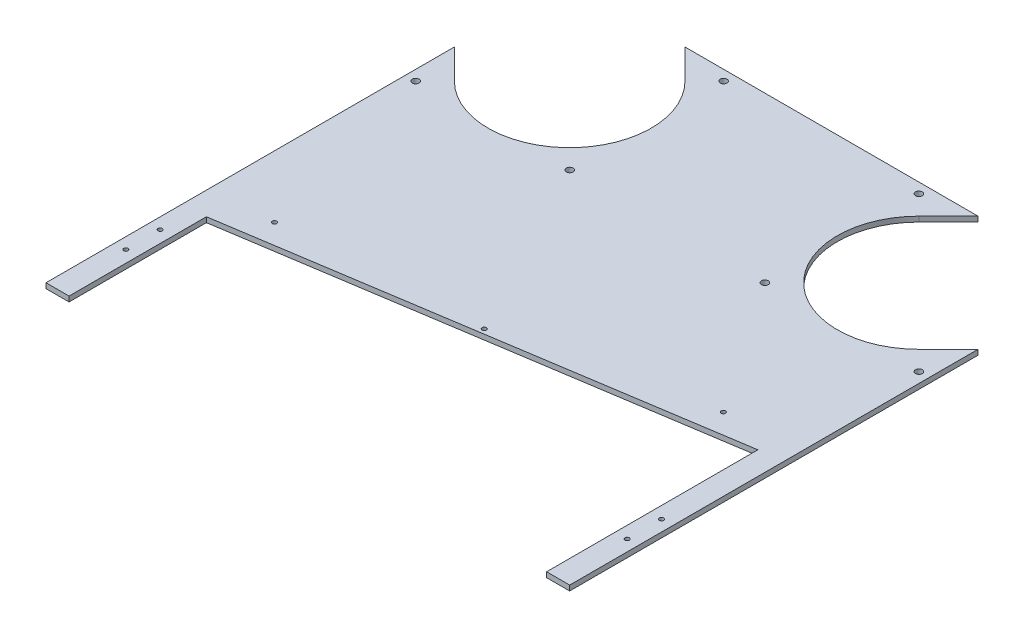
ISO-10303-21;
HEADER;
FILE_DESCRIPTION(('STEP AP214'),'2;1');
FILE_NAME('part.step','',(''),(''),'','','');
FILE_SCHEMA(('AUTOMOTIVE_DESIGN { 1 0 10303 214 1 1 1 1 }'));
ENDSEC;
DATA;
#1=APPLICATION_CONTEXT('core data for automotive mechanical design processes');
#2=APPLICATION_PROTOCOL_DEFINITION('international standard','automotive_design',2000,#1);
#3=PRODUCT_CONTEXT('',#1,'mechanical');
#4=PRODUCT('Part','Part','',(#3));
#5=PRODUCT_RELATED_PRODUCT_CATEGORY('part','',(#4));
#6=PRODUCT_DEFINITION_FORMATION('','',#4);
#7=PRODUCT_DEFINITION_CONTEXT('part definition',#1,'design');
#8=PRODUCT_DEFINITION('design','',#6,#7);
#9=PRODUCT_DEFINITION_SHAPE('','',#8);
#10=(LENGTH_UNIT() NAMED_UNIT(*) SI_UNIT(.MILLI.,.METRE.));
#11=(NAMED_UNIT(*) PLANE_ANGLE_UNIT() SI_UNIT($,.RADIAN.));
#12=(NAMED_UNIT(*) SI_UNIT($,.STERADIAN.) SOLID_ANGLE_UNIT());
#13=UNCERTAINTY_MEASURE_WITH_UNIT(LENGTH_MEASURE(1.E-05),#10,'distance_accuracy_value','');
#14=(GEOMETRIC_REPRESENTATION_CONTEXT(3) GLOBAL_UNCERTAINTY_ASSIGNED_CONTEXT((#13)) GLOBAL_UNIT_ASSIGNED_CONTEXT((#10,
#11,#12)) REPRESENTATION_CONTEXT('',''));
#15=CARTESIAN_POINT('',(0.,0.,0.));
#16=DIRECTION('',(0.,0.,1.));
#17=DIRECTION('',(1.,0.,0.));
#18=AXIS2_PLACEMENT_3D('',#15,#16,#17);
#19=CARTESIAN_POINT('',(0.,-3.,0.));
#20=DIRECTION('',(0.,1.,0.));
#21=DIRECTION('',(0.,0.,1.));
#22=AXIS2_PLACEMENT_3D('',#19,#20,#21);
#23=PLANE('',#22);
#24=CARTESIAN_POINT('',(209.3563,-3.,-104.3563));
#25=DIRECTION('',(0.,1.,0.));
#26=DIRECTION('',(0.,0.,1.));
#27=AXIS2_PLACEMENT_3D('',#24,#25,#26);
#28=CIRCLE('',#27,1.98437499999028);
#29=CARTESIAN_POINT('',(209.3563,-3.,-102.37192500001));
#30=VERTEX_POINT('',#29);
#31=EDGE_CURVE('E461',#30,#30,#28,.T.);
#32=ORIENTED_EDGE('',*,*,#31,.T.);
#33=EDGE_LOOP('',(#32));
#34=FACE_BOUND('',#33,.T.);
#35=CARTESIAN_POINT('',(95.6437,-3.,-104.356299999999));
#36=DIRECTION('',(0.,1.,0.));
#37=DIRECTION('',(0.,0.,1.));
#38=AXIS2_PLACEMENT_3D('',#35,#36,#37);
#39=CIRCLE('',#38,1.98437500000119);
#40=CARTESIAN_POINT('',(95.6437,-3.,-102.371924999998));
#41=VERTEX_POINT('',#40);
#42=EDGE_CURVE('E449',#41,#41,#39,.T.);
#43=ORIENTED_EDGE('',*,*,#42,.T.);
#44=EDGE_LOOP('',(#43));
#45=FACE_BOUND('',#44,.T.);
#46=CARTESIAN_POINT('',(95.6437,-3.,-194.043699999999));
#47=DIRECTION('',(0.,1.,0.));
#48=DIRECTION('',(0.,0.,1.));
#49=AXIS2_PLACEMENT_3D('',#46,#47,#48);
#50=CIRCLE('',#49,1.98437500000119);
#51=CARTESIAN_POINT('',(95.6437,-3.,-192.059324999998));
#52=VERTEX_POINT('',#51);
#53=EDGE_CURVE('E437',#52,#52,#50,.T.);
#54=ORIENTED_EDGE('',*,*,#53,.T.);
#55=EDGE_LOOP('',(#54));
#56=FACE_BOUND('',#55,.T.);
#57=CARTESIAN_POINT('',(36.1163180693323,-3.,8.03125688471848));
#58=DIRECTION('',(0.,1.,0.));
#59=DIRECTION('',(0.,0.,1.));
#60=AXIS2_PLACEMENT_3D('',#57,#58,#59);
#61=CIRCLE('',#60,1.24999999999999);
#62=CARTESIAN_POINT('',(36.1163180693323,-3.,9.28125688471847));
#63=VERTEX_POINT('',#62);
#64=EDGE_CURVE('E155',#63,#63,#61,.T.);
#65=ORIENTED_EDGE('',*,*,#64,.T.);
#66=EDGE_LOOP('',(#65));
#67=FACE_BOUND('',#66,.T.);
#68=CARTESIAN_POINT('',(150.877899470198,-3.,0.629943867926315));
#69=DIRECTION('',(0.,1.,0.));
#70=DIRECTION('',(0.,0.,1.));
#71=AXIS2_PLACEMENT_3D('',#68,#69,#70);
#72=CIRCLE('',#71,1.25);
#73=CARTESIAN_POINT('',(150.877899470198,-3.,1.87994386792632));
#74=VERTEX_POINT('',#73);
#75=EDGE_CURVE('E332',#74,#74,#72,.T.);
#76=ORIENTED_EDGE('',*,*,#75,.T.);
#77=EDGE_LOOP('',(#76));
#78=FACE_BOUND('',#77,.T.);
#79=CARTESIAN_POINT('',(262.50800034301,-3.,-27.0055510457858));
#80=DIRECTION('',(0.,1.,0.));
#81=DIRECTION('',(0.,0.,1.));
#82=AXIS2_PLACEMENT_3D('',#79,#80,#81);
#83=CIRCLE('',#82,1.24999999999997);
#84=CARTESIAN_POINT('',(262.50800034301,-3.,-25.7555510457858));
#85=VERTEX_POINT('',#84);
#86=EDGE_CURVE('E339',#85,#85,#83,.T.);
#87=ORIENTED_EDGE('',*,*,#86,.T.);
#88=EDGE_LOOP('',(#87));
#89=FACE_BOUND('',#88,.T.);
#90=CARTESIAN_POINT('',(6.50000000000003,-3.,45.));
#91=DIRECTION('',(0.,1.,0.));
#92=DIRECTION('',(0.,0.,1.));
#93=AXIS2_PLACEMENT_3D('',#90,#91,#92);
#94=CIRCLE('',#93,1.24999999999999);
#95=CARTESIAN_POINT('',(6.50000000000003,-3.,46.25));
#96=VERTEX_POINT('',#95);
#97=EDGE_CURVE('E328',#96,#96,#94,.T.);
#98=ORIENTED_EDGE('',*,*,#97,.T.);
#99=EDGE_LOOP('',(#98));
#100=FACE_BOUND('',#99,.T.);
#101=CARTESIAN_POINT('',(6.5,-3.,65.));
#102=DIRECTION('',(0.,1.,0.));
#103=DIRECTION('',(0.,0.,1.));
#104=AXIS2_PLACEMENT_3D('',#101,#102,#103);
#105=CIRCLE('',#104,1.24999999999999);
#106=CARTESIAN_POINT('',(6.5,-3.,66.25));
#107=VERTEX_POINT('',#106);
#108=EDGE_CURVE('E356',#107,#107,#105,.T.);
#109=ORIENTED_EDGE('',*,*,#108,.T.);
#110=EDGE_LOOP('',(#109));
#111=FACE_BOUND('',#110,.T.);
#112=CARTESIAN_POINT('',(298.5,-3.,45.));
#113=DIRECTION('',(0.,1.,0.));
#114=DIRECTION('',(0.,0.,1.));
#115=AXIS2_PLACEMENT_3D('',#112,#113,#114);
#116=CIRCLE('',#115,1.24999999999997);
#117=CARTESIAN_POINT('',(298.5,-3.,46.2499999999999));
#118=VERTEX_POINT('',#117);
#119=EDGE_CURVE('E324',#118,#118,#116,.T.);
#120=ORIENTED_EDGE('',*,*,#119,.T.);
#121=EDGE_LOOP('',(#120));
#122=FACE_BOUND('',#121,.T.);
#123=CARTESIAN_POINT('',(298.5,-3.,65.));
#124=DIRECTION('',(0.,1.,0.));
#125=DIRECTION('',(0.,0.,1.));
#126=AXIS2_PLACEMENT_3D('',#123,#124,#125);
#127=CIRCLE('',#126,1.24999999999997);
#128=CARTESIAN_POINT('',(298.5,-3.,66.2499999999999));
#129=VERTEX_POINT('',#128);
#130=EDGE_CURVE('E296',#129,#129,#127,.T.);
#131=ORIENTED_EDGE('',*,*,#130,.T.);
#132=EDGE_LOOP('',(#131));
#133=FACE_BOUND('',#132,.T.);
#134=DIRECTION('',(0.707106781186547,0.,-0.707106781186548));
#135=VECTOR('',#134,1.);
#136=CARTESIAN_POINT('',(86.0875721063613,-3.,86.0875721063612));
#137=LINE('',#136,#135);
#138=CARTESIAN_POINT('',(287.787572106361,-3.,-115.612427893639));
#139=VERTEX_POINT('',#138);
#140=CARTESIAN_POINT('',(305.,-3.,-132.824855787278));
#141=VERTEX_POINT('',#140);
#142=EDGE_CURVE('E425',#139,#141,#137,.T.);
#143=ORIENTED_EDGE('',*,*,#142,.T.);
#144=DIRECTION('',(0.,0.,-1.));
#145=VECTOR('',#144,1.);
#146=CARTESIAN_POINT('',(305.,-3.,-35.3098329762697));
#147=LINE('',#146,#145);
#148=CARTESIAN_POINT('',(305.,-3.,105.));
#149=VERTEX_POINT('',#148);
#150=EDGE_CURVE('E282',#149,#141,#147,.T.);
#151=ORIENTED_EDGE('',*,*,#150,.F.);
#152=DIRECTION('',(1.,0.,0.));
#153=VECTOR('',#152,1.);
#154=CARTESIAN_POINT('',(305.,-3.,105.));
#155=LINE('',#154,#153);
#156=CARTESIAN_POINT('',(291.57115,-3.,105.));
#157=VERTEX_POINT('',#156);
#158=EDGE_CURVE('E288',#157,#149,#155,.T.);
#159=ORIENTED_EDGE('',*,*,#158,.F.);
#160=DIRECTION('',(0.,0.,1.));
#161=VECTOR('',#160,1.);
#162=CARTESIAN_POINT('',(291.57115,-3.,105.));
#163=LINE('',#162,#161);
#164=CARTESIAN_POINT('',(291.57115,-3.,-18.0458320931951));
#165=VERTEX_POINT('',#164);
#166=EDGE_CURVE('E373',#165,#157,#163,.T.);
#167=ORIENTED_EDGE('',*,*,#166,.F.);
#168=DIRECTION('',(0.988235294144316,0.,-0.152941176298267));
#169=VECTOR('',#168,1.);
#170=CARTESIAN_POINT('',(291.57115,-3.,-18.0458320931951));
#171=LINE('',#170,#169);
#172=CARTESIAN_POINT('',(13.42885,-3.,25.));
#173=VERTEX_POINT('',#172);
#174=EDGE_CURVE('E370',#173,#165,#171,.T.);
#175=ORIENTED_EDGE('',*,*,#174,.F.);
#176=DIRECTION('',(0.,0.,-1.));
#177=VECTOR('',#176,1.);
#178=CARTESIAN_POINT('',(13.42885,-3.,105.));
#179=LINE('',#178,#177);
#180=CARTESIAN_POINT('',(13.42885,-3.,105.));
#181=VERTEX_POINT('',#180);
#182=EDGE_CURVE('E367',#181,#173,#179,.T.);
#183=ORIENTED_EDGE('',*,*,#182,.F.);
#184=DIRECTION('',(1.,0.,0.));
#185=VECTOR('',#184,1.);
#186=CARTESIAN_POINT('',(0.,-3.,105.));
#187=LINE('',#186,#185);
#188=CARTESIAN_POINT('',(0.,-3.,105.));
#189=VERTEX_POINT('',#188);
#190=EDGE_CURVE('E364',#189,#181,#187,.T.);
#191=ORIENTED_EDGE('',*,*,#190,.F.);
#192=DIRECTION('',(0.,0.,1.));
#193=VECTOR('',#192,1.);
#194=CARTESIAN_POINT('',(0.,-3.,0.));
#195=LINE('',#194,#193);
#196=CARTESIAN_POINT('',(0.,-3.,-132.824855787713));
#197=VERTEX_POINT('',#196);
#198=EDGE_CURVE('E313',#197,#189,#195,.T.);
#199=ORIENTED_EDGE('',*,*,#198,.F.);
#200=DIRECTION('',(0.707106781186552,0.,0.707106781186543));
#201=VECTOR('',#200,1.);
#202=CARTESIAN_POINT('',(66.4124278938565,-3.,-66.4124278938574));
#203=LINE('',#202,#201);
#204=CARTESIAN_POINT('',(17.2124278938845,-3.,-115.612427893829));
#205=VERTEX_POINT('',#204);
#206=EDGE_CURVE('E399',#197,#205,#203,.T.);
#207=ORIENTED_EDGE('',*,*,#206,.T.);
#208=CARTESIAN_POINT('',(50.8000000002453,-3.,-149.20000000019));
#209=DIRECTION('',(0.,1.,0.));
#210=DIRECTION('',(0.,0.,1.));
#211=AXIS2_PLACEMENT_3D('',#208,#209,#210);
#212=CIRCLE('',#211,47.5);
#213=CARTESIAN_POINT('',(84.3875721066061,-3.,-182.787572106551));
#214=VERTEX_POINT('',#213);
#215=EDGE_CURVE('E406',#205,#214,#212,.T.);
#216=ORIENTED_EDGE('',*,*,#215,.T.);
#217=DIRECTION('',(-0.707106781186551,0.,-0.707106781186544));
#218=VECTOR('',#217,1.);
#219=CARTESIAN_POINT('',(133.587572106578,-3.,-133.58757210658));
#220=LINE('',#219,#218);
#221=CARTESIAN_POINT('',(67.1751442131571,-3.,-200.));
#222=VERTEX_POINT('',#221);
#223=EDGE_CURVE('E280',#214,#222,#220,.T.);
#224=ORIENTED_EDGE('',*,*,#223,.T.);
#225=DIRECTION('',(-1.,0.,0.));
#226=VECTOR('',#225,1.);
#227=CARTESIAN_POINT('',(0.,-3.,-200.));
#228=LINE('',#227,#226);
#229=CARTESIAN_POINT('',(237.824855787278,-3.,-200.));
#230=VERTEX_POINT('',#229);
#231=EDGE_CURVE('E271',#230,#222,#228,.T.);
#232=ORIENTED_EDGE('',*,*,#231,.F.);
#233=DIRECTION('',(0.707106781186545,0.,-0.70710678118655));
#234=VECTOR('',#233,1.);
#235=CARTESIAN_POINT('',(18.9124278936398,-3.,18.9124278936397));
#236=LINE('',#235,#234);
#237=CARTESIAN_POINT('',(220.612427893639,-3.,-182.787572106361));
#238=VERTEX_POINT('',#237);
#239=EDGE_CURVE('E255',#238,#230,#236,.T.);
#240=ORIENTED_EDGE('',*,*,#239,.F.);
#241=CARTESIAN_POINT('',(254.2,-3.,-149.2));
#242=DIRECTION('',(0.,1.,0.));
#243=DIRECTION('',(0.,0.,1.));
#244=AXIS2_PLACEMENT_3D('',#241,#242,#243);
#245=CIRCLE('',#244,47.5);
#246=EDGE_CURVE('E265',#238,#139,#245,.T.);
#247=ORIENTED_EDGE('',*,*,#246,.T.);
#248=EDGE_LOOP('',(#143,#151,#159,#167,#175,#183,#191,#199,#207,#216,#224,#232,#240,#247));
#249=FACE_BOUND('',#248,.T.);
#250=CARTESIAN_POINT('',(5.95629999999996,-3.,-104.356299999999));
#251=DIRECTION('',(0.,1.,0.));
#252=DIRECTION('',(0.,0.,1.));
#253=AXIS2_PLACEMENT_3D('',#250,#251,#252);
#254=CIRCLE('',#253,1.98437500000119);
#255=CARTESIAN_POINT('',(5.95629999999996,-3.,-102.371924999998));
#256=VERTEX_POINT('',#255);
#257=EDGE_CURVE('E443',#256,#256,#254,.T.);
#258=ORIENTED_EDGE('',*,*,#257,.T.);
#259=EDGE_LOOP('',(#258));
#260=FACE_BOUND('',#259,.T.);
#261=CARTESIAN_POINT('',(209.3563,-3.,-194.0437));
#262=DIRECTION('',(0.,1.,0.));
#263=DIRECTION('',(0.,0.,1.));
#264=AXIS2_PLACEMENT_3D('',#261,#262,#263);
#265=CIRCLE('',#264,1.9843749999903);
#266=CARTESIAN_POINT('',(209.3563,-3.,-192.05932500001));
#267=VERTEX_POINT('',#266);
#268=EDGE_CURVE('E455',#267,#267,#265,.T.);
#269=ORIENTED_EDGE('',*,*,#268,.T.);
#270=EDGE_LOOP('',(#269));
#271=FACE_BOUND('',#270,.T.);
#272=CARTESIAN_POINT('',(299.0437,-3.,-104.3563));
#273=DIRECTION('',(0.,1.,0.));
#274=DIRECTION('',(0.,0.,1.));
#275=AXIS2_PLACEMENT_3D('',#272,#273,#274);
#276=CIRCLE('',#275,1.98437499999028);
#277=CARTESIAN_POINT('',(299.0437,-3.,-102.37192500001));
#278=VERTEX_POINT('',#277);
#279=EDGE_CURVE('E467',#278,#278,#276,.T.);
#280=ORIENTED_EDGE('',*,*,#279,.T.);
#281=EDGE_LOOP('',(#280));
#282=FACE_BOUND('',#281,.T.);
#283=ADVANCED_FACE('F151',(#34,#45,#56,#67,#78,#89,#100,#111,#122,#133,#249,#260,#271,#282),#23,.F.);
#284=CARTESIAN_POINT('',(0.,0.,0.));
#285=DIRECTION('',(0.,1.,0.));
#286=DIRECTION('',(0.,0.,1.));
#287=AXIS2_PLACEMENT_3D('',#284,#285,#286);
#288=PLANE('',#287);
#289=CARTESIAN_POINT('',(209.3563,0.,-104.3563));
#290=DIRECTION('',(0.,1.,0.));
#291=DIRECTION('',(0.,0.,1.));
#292=AXIS2_PLACEMENT_3D('',#289,#290,#291);
#293=CIRCLE('',#292,1.98437499999028);
#294=CARTESIAN_POINT('',(209.3563,0.,-102.37192500001));
#295=VERTEX_POINT('',#294);
#296=EDGE_CURVE('E458',#295,#295,#293,.T.);
#297=ORIENTED_EDGE('',*,*,#296,.F.);
#298=EDGE_LOOP('',(#297));
#299=FACE_BOUND('',#298,.T.);
#300=CARTESIAN_POINT('',(95.6437,0.,-104.356299999999));
#301=DIRECTION('',(0.,1.,0.));
#302=DIRECTION('',(0.,0.,1.));
#303=AXIS2_PLACEMENT_3D('',#300,#301,#302);
#304=CIRCLE('',#303,1.98437500000119);
#305=CARTESIAN_POINT('',(95.6437,0.,-102.371924999998));
#306=VERTEX_POINT('',#305);
#307=EDGE_CURVE('E446',#306,#306,#304,.T.);
#308=ORIENTED_EDGE('',*,*,#307,.F.);
#309=EDGE_LOOP('',(#308));
#310=FACE_BOUND('',#309,.T.);
#311=CARTESIAN_POINT('',(95.6437,0.,-194.043699999999));
#312=DIRECTION('',(0.,1.,0.));
#313=DIRECTION('',(0.,0.,1.));
#314=AXIS2_PLACEMENT_3D('',#311,#312,#313);
#315=CIRCLE('',#314,1.98437500000119);
#316=CARTESIAN_POINT('',(95.6437,0.,-192.059324999998));
#317=VERTEX_POINT('',#316);
#318=EDGE_CURVE('E434',#317,#317,#315,.T.);
#319=ORIENTED_EDGE('',*,*,#318,.F.);
#320=EDGE_LOOP('',(#319));
#321=FACE_BOUND('',#320,.T.);
#322=CARTESIAN_POINT('',(36.1163180693323,0.,8.03125688471848));
#323=DIRECTION('',(0.,1.,0.));
#324=DIRECTION('',(0.,0.,1.));
#325=AXIS2_PLACEMENT_3D('',#322,#323,#324);
#326=CIRCLE('',#325,1.24999999999999);
#327=CARTESIAN_POINT('',(36.1163180693323,0.,9.28125688471847));
#328=VERTEX_POINT('',#327);
#329=EDGE_CURVE('E346',#328,#328,#326,.T.);
#330=ORIENTED_EDGE('',*,*,#329,.F.);
#331=EDGE_LOOP('',(#330));
#332=FACE_BOUND('',#331,.T.);
#333=CARTESIAN_POINT('',(150.877899470198,0.,0.629943867926315));
#334=DIRECTION('',(0.,1.,0.));
#335=DIRECTION('',(0.,0.,1.));
#336=AXIS2_PLACEMENT_3D('',#333,#334,#335);
#337=CIRCLE('',#336,1.25);
#338=CARTESIAN_POINT('',(150.877899470198,0.,1.87994386792632));
#339=VERTEX_POINT('',#338);
#340=EDGE_CURVE('E335',#339,#339,#337,.T.);
#341=ORIENTED_EDGE('',*,*,#340,.F.);
#342=EDGE_LOOP('',(#341));
#343=FACE_BOUND('',#342,.T.);
#344=CARTESIAN_POINT('',(262.50800034301,0.,-27.0055510457858));
#345=DIRECTION('',(0.,1.,0.));
#346=DIRECTION('',(0.,0.,1.));
#347=AXIS2_PLACEMENT_3D('',#344,#345,#346);
#348=CIRCLE('',#347,1.24999999999997);
#349=CARTESIAN_POINT('',(262.50800034301,0.,-25.7555510457858));
#350=VERTEX_POINT('',#349);
#351=EDGE_CURVE('E334',#350,#350,#348,.T.);
#352=ORIENTED_EDGE('',*,*,#351,.F.);
#353=EDGE_LOOP('',(#352));
#354=FACE_BOUND('',#353,.T.);
#355=CARTESIAN_POINT('',(6.50000000000003,0.,45.));
#356=DIRECTION('',(0.,1.,0.));
#357=DIRECTION('',(0.,0.,1.));
#358=AXIS2_PLACEMENT_3D('',#355,#356,#357);
#359=CIRCLE('',#358,1.24999999999999);
#360=CARTESIAN_POINT('',(6.50000000000003,0.,46.25));
#361=VERTEX_POINT('',#360);
#362=EDGE_CURVE('E331',#361,#361,#359,.T.);
#363=ORIENTED_EDGE('',*,*,#362,.F.);
#364=EDGE_LOOP('',(#363));
#365=FACE_BOUND('',#364,.T.);
#366=CARTESIAN_POINT('',(6.5,0.,65.));
#367=DIRECTION('',(0.,1.,0.));
#368=DIRECTION('',(0.,0.,1.));
#369=AXIS2_PLACEMENT_3D('',#366,#367,#368);
#370=CIRCLE('',#369,1.24999999999999);
#371=CARTESIAN_POINT('',(6.5,0.,66.25));
#372=VERTEX_POINT('',#371);
#373=EDGE_CURVE('E330',#372,#372,#370,.T.);
#374=ORIENTED_EDGE('',*,*,#373,.F.);
#375=EDGE_LOOP('',(#374));
#376=FACE_BOUND('',#375,.T.);
#377=CARTESIAN_POINT('',(298.5,0.,45.));
#378=DIRECTION('',(0.,1.,0.));
#379=DIRECTION('',(0.,0.,1.));
#380=AXIS2_PLACEMENT_3D('',#377,#378,#379);
#381=CIRCLE('',#380,1.24999999999997);
#382=CARTESIAN_POINT('',(298.5,0.,46.2499999999999));
#383=VERTEX_POINT('',#382);
#384=EDGE_CURVE('E327',#383,#383,#381,.T.);
#385=ORIENTED_EDGE('',*,*,#384,.F.);
#386=EDGE_LOOP('',(#385));
#387=FACE_BOUND('',#386,.T.);
#388=CARTESIAN_POINT('',(298.5,0.,65.));
#389=DIRECTION('',(0.,1.,0.));
#390=DIRECTION('',(0.,0.,1.));
#391=AXIS2_PLACEMENT_3D('',#388,#389,#390);
#392=CIRCLE('',#391,1.24999999999997);
#393=CARTESIAN_POINT('',(298.5,0.,66.2499999999999));
#394=VERTEX_POINT('',#393);
#395=EDGE_CURVE('E323',#394,#394,#392,.T.);
#396=ORIENTED_EDGE('',*,*,#395,.F.);
#397=EDGE_LOOP('',(#396));
#398=FACE_BOUND('',#397,.T.);
#399=DIRECTION('',(0.,0.,-1.));
#400=VECTOR('',#399,1.);
#401=CARTESIAN_POINT('',(305.,0.,-200.));
#402=LINE('',#401,#400);
#403=CARTESIAN_POINT('',(305.,0.,105.));
#404=VERTEX_POINT('',#403);
#405=CARTESIAN_POINT('',(305.,0.,-132.824855787278));
#406=VERTEX_POINT('',#405);
#407=EDGE_CURVE('E308',#404,#406,#402,.T.);
#408=ORIENTED_EDGE('',*,*,#407,.T.);
#409=DIRECTION('',(0.707106781186547,0.,-0.707106781186548));
#410=VECTOR('',#409,1.);
#411=CARTESIAN_POINT('',(86.0875721063613,0.,86.0875721063612));
#412=LINE('',#411,#410);
#413=CARTESIAN_POINT('',(287.787572106361,0.,-115.612427893639));
#414=VERTEX_POINT('',#413);
#415=EDGE_CURVE('E168',#414,#406,#412,.T.);
#416=ORIENTED_EDGE('',*,*,#415,.F.);
#417=CARTESIAN_POINT('',(254.2,0.,-149.2));
#418=DIRECTION('',(0.,1.,0.));
#419=DIRECTION('',(0.,0.,1.));
#420=AXIS2_PLACEMENT_3D('',#417,#418,#419);
#421=CIRCLE('',#420,47.5);
#422=CARTESIAN_POINT('',(220.612427893639,0.,-182.787572106361));
#423=VERTEX_POINT('',#422);
#424=EDGE_CURVE('E430',#423,#414,#421,.T.);
#425=ORIENTED_EDGE('',*,*,#424,.F.);
#426=DIRECTION('',(0.707106781186545,0.,-0.70710678118655));
#427=VECTOR('',#426,1.);
#428=CARTESIAN_POINT('',(18.9124278936398,0.,18.9124278936397));
#429=LINE('',#428,#427);
#430=CARTESIAN_POINT('',(237.824855787278,0.,-200.));
#431=VERTEX_POINT('',#430);
#432=EDGE_CURVE('E432',#423,#431,#429,.T.);
#433=ORIENTED_EDGE('',*,*,#432,.T.);
#434=DIRECTION('',(-1.,0.,0.));
#435=VECTOR('',#434,1.);
#436=CARTESIAN_POINT('',(0.,0.,-200.));
#437=LINE('',#436,#435);
#438=CARTESIAN_POINT('',(67.1751442131571,0.,-200.));
#439=VERTEX_POINT('',#438);
#440=EDGE_CURVE('E273',#431,#439,#437,.T.);
#441=ORIENTED_EDGE('',*,*,#440,.T.);
#442=DIRECTION('',(-0.707106781186551,0.,-0.707106781186544));
#443=VECTOR('',#442,1.);
#444=CARTESIAN_POINT('',(133.587572106578,0.,-133.58757210658));
#445=LINE('',#444,#443);
#446=CARTESIAN_POINT('',(84.3875721066061,0.,-182.787572106551));
#447=VERTEX_POINT('',#446);
#448=EDGE_CURVE('E414',#447,#439,#445,.T.);
#449=ORIENTED_EDGE('',*,*,#448,.F.);
#450=CARTESIAN_POINT('',(50.8000000002453,0.,-149.20000000019));
#451=DIRECTION('',(0.,1.,0.));
#452=DIRECTION('',(0.,0.,1.));
#453=AXIS2_PLACEMENT_3D('',#450,#451,#452);
#454=CIRCLE('',#453,47.5);
#455=CARTESIAN_POINT('',(17.2124278938845,0.,-115.612427893829));
#456=VERTEX_POINT('',#455);
#457=EDGE_CURVE('E417',#456,#447,#454,.T.);
#458=ORIENTED_EDGE('',*,*,#457,.F.);
#459=DIRECTION('',(0.707106781186552,0.,0.707106781186543));
#460=VECTOR('',#459,1.);
#461=CARTESIAN_POINT('',(66.4124278938565,0.,-66.4124278938574));
#462=LINE('',#461,#460);
#463=CARTESIAN_POINT('',(0.,0.,-132.824855787713));
#464=VERTEX_POINT('',#463);
#465=EDGE_CURVE('E419',#464,#456,#462,.T.);
#466=ORIENTED_EDGE('',*,*,#465,.F.);
#467=DIRECTION('',(0.,0.,1.));
#468=VECTOR('',#467,1.);
#469=CARTESIAN_POINT('',(0.,0.,0.));
#470=LINE('',#469,#468);
#471=CARTESIAN_POINT('',(0.,0.,105.));
#472=VERTEX_POINT('',#471);
#473=EDGE_CURVE('E312',#464,#472,#470,.T.);
#474=ORIENTED_EDGE('',*,*,#473,.T.);
#475=DIRECTION('',(1.,0.,0.));
#476=VECTOR('',#475,1.);
#477=CARTESIAN_POINT('',(0.,0.,105.));
#478=LINE('',#477,#476);
#479=CARTESIAN_POINT('',(13.42885,0.,105.));
#480=VERTEX_POINT('',#479);
#481=EDGE_CURVE('E292',#472,#480,#478,.T.);
#482=ORIENTED_EDGE('',*,*,#481,.T.);
#483=DIRECTION('',(0.,0.,-1.));
#484=VECTOR('',#483,1.);
#485=CARTESIAN_POINT('',(13.42885,0.,105.));
#486=LINE('',#485,#484);
#487=CARTESIAN_POINT('',(13.42885,0.,25.));
#488=VERTEX_POINT('',#487);
#489=EDGE_CURVE('E295',#480,#488,#486,.T.);
#490=ORIENTED_EDGE('',*,*,#489,.T.);
#491=DIRECTION('',(0.988235294144316,0.,-0.152941176298267));
#492=VECTOR('',#491,1.);
#493=CARTESIAN_POINT('',(291.57115,0.,-18.0458320931951));
#494=LINE('',#493,#492);
#495=CARTESIAN_POINT('',(291.57115,0.,-18.0458320931951));
#496=VERTEX_POINT('',#495);
#497=EDGE_CURVE('E299',#488,#496,#494,.T.);
#498=ORIENTED_EDGE('',*,*,#497,.T.);
#499=DIRECTION('',(0.,0.,1.));
#500=VECTOR('',#499,1.);
#501=CARTESIAN_POINT('',(291.57115,0.,105.));
#502=LINE('',#501,#500);
#503=CARTESIAN_POINT('',(291.57115,0.,105.));
#504=VERTEX_POINT('',#503);
#505=EDGE_CURVE('E302',#496,#504,#502,.T.);
#506=ORIENTED_EDGE('',*,*,#505,.T.);
#507=DIRECTION('',(1.,0.,0.));
#508=VECTOR('',#507,1.);
#509=CARTESIAN_POINT('',(305.,0.,105.));
#510=LINE('',#509,#508);
#511=EDGE_CURVE('E305',#504,#404,#510,.T.);
#512=ORIENTED_EDGE('',*,*,#511,.T.);
#513=EDGE_LOOP('',(#408,#416,#425,#433,#441,#449,#458,#466,#474,#482,#490,#498,#506,#512));
#514=FACE_BOUND('',#513,.T.);
#515=CARTESIAN_POINT('',(5.95629999999996,0.,-104.356299999999));
#516=DIRECTION('',(0.,1.,0.));
#517=DIRECTION('',(0.,0.,1.));
#518=AXIS2_PLACEMENT_3D('',#515,#516,#517);
#519=CIRCLE('',#518,1.98437500000119);
#520=CARTESIAN_POINT('',(5.95629999999996,0.,-102.371924999998));
#521=VERTEX_POINT('',#520);
#522=EDGE_CURVE('E440',#521,#521,#519,.T.);
#523=ORIENTED_EDGE('',*,*,#522,.F.);
#524=EDGE_LOOP('',(#523));
#525=FACE_BOUND('',#524,.T.);
#526=CARTESIAN_POINT('',(209.3563,0.,-194.0437));
#527=DIRECTION('',(0.,1.,0.));
#528=DIRECTION('',(0.,0.,1.));
#529=AXIS2_PLACEMENT_3D('',#526,#527,#528);
#530=CIRCLE('',#529,1.9843749999903);
#531=CARTESIAN_POINT('',(209.3563,0.,-192.05932500001));
#532=VERTEX_POINT('',#531);
#533=EDGE_CURVE('E452',#532,#532,#530,.T.);
#534=ORIENTED_EDGE('',*,*,#533,.F.);
#535=EDGE_LOOP('',(#534));
#536=FACE_BOUND('',#535,.T.);
#537=CARTESIAN_POINT('',(299.0437,0.,-104.3563));
#538=DIRECTION('',(0.,1.,0.));
#539=DIRECTION('',(0.,0.,1.));
#540=AXIS2_PLACEMENT_3D('',#537,#538,#539);
#541=CIRCLE('',#540,1.98437499999028);
#542=CARTESIAN_POINT('',(299.0437,0.,-102.37192500001));
#543=VERTEX_POINT('',#542);
#544=EDGE_CURVE('E464',#543,#543,#541,.T.);
#545=ORIENTED_EDGE('',*,*,#544,.F.);
#546=EDGE_LOOP('',(#545));
#547=FACE_BOUND('',#546,.T.);
#548=ADVANCED_FACE('F476',(#299,#310,#321,#332,#343,#354,#365,#376,#387,#398,#514,#525,#536,
#547),#288,.T.);
#549=CARTESIAN_POINT('',(0.,-3.,-200.));
#550=DIRECTION('',(0.,0.,-1.));
#551=DIRECTION('',(-1.,0.,0.));
#552=AXIS2_PLACEMENT_3D('',#549,#550,#551);
#553=PLANE('',#552);
#554=ORIENTED_EDGE('',*,*,#440,.F.);
#555=DIRECTION('',(0.,1.,0.));
#556=VECTOR('',#555,1.);
#557=CARTESIAN_POINT('',(237.824855787278,0.,-200.));
#558=LINE('',#557,#556);
#559=EDGE_CURVE('E258',#431,#230,#558,.F.);
#560=ORIENTED_EDGE('',*,*,#559,.T.);
#561=ORIENTED_EDGE('',*,*,#231,.T.);
#562=DIRECTION('',(0.,1.,0.));
#563=VECTOR('',#562,1.);
#564=CARTESIAN_POINT('',(67.1751442131571,0.,-200.));
#565=LINE('',#564,#563);
#566=EDGE_CURVE('E403',#439,#222,#565,.F.);
#567=ORIENTED_EDGE('',*,*,#566,.F.);
#568=EDGE_LOOP('',(#554,#560,#561,#567));
#569=FACE_BOUND('',#568,.T.);
#570=ADVANCED_FACE('F269',(#569),#553,.T.);
#571=CARTESIAN_POINT('',(305.,-3.,-200.));
#572=DIRECTION('',(1.,0.,0.));
#573=DIRECTION('',(0.,0.,-1.));
#574=AXIS2_PLACEMENT_3D('',#571,#572,#573);
#575=PLANE('',#574);
#576=ORIENTED_EDGE('',*,*,#150,.T.);
#577=DIRECTION('',(0.,1.,0.));
#578=VECTOR('',#577,1.);
#579=CARTESIAN_POINT('',(305.,0.,-132.824855787278));
#580=LINE('',#579,#578);
#581=EDGE_CURVE('E274',#406,#141,#580,.F.);
#582=ORIENTED_EDGE('',*,*,#581,.F.);
#583=ORIENTED_EDGE('',*,*,#407,.F.);
#584=DIRECTION('',(0.,1.,0.));
#585=VECTOR('',#584,1.);
#586=CARTESIAN_POINT('',(305.,-3.,105.));
#587=LINE('',#586,#585);
#588=EDGE_CURVE('E12',#149,#404,#587,.T.);
#589=ORIENTED_EDGE('',*,*,#588,.F.);
#590=EDGE_LOOP('',(#576,#582,#583,#589));
#591=FACE_BOUND('',#590,.T.);
#592=ADVANCED_FACE('F484',(#591),#575,.T.);
#593=CARTESIAN_POINT('',(0.,-3.,0.));
#594=DIRECTION('',(-1.,0.,0.));
#595=DIRECTION('',(0.,0.,1.));
#596=AXIS2_PLACEMENT_3D('',#593,#594,#595);
#597=PLANE('',#596);
#598=ORIENTED_EDGE('',*,*,#473,.F.);
#599=DIRECTION('',(0.,1.,0.));
#600=VECTOR('',#599,1.);
#601=CARTESIAN_POINT('',(0.,0.,-132.824855787713));
#602=LINE('',#601,#600);
#603=EDGE_CURVE('E176',#464,#197,#602,.F.);
#604=ORIENTED_EDGE('',*,*,#603,.T.);
#605=ORIENTED_EDGE('',*,*,#198,.T.);
#606=DIRECTION('',(0.,1.,0.));
#607=VECTOR('',#606,1.);
#608=CARTESIAN_POINT('',(0.,-3.,105.));
#609=LINE('',#608,#607);
#610=EDGE_CURVE('E281',#189,#472,#609,.T.);
#611=ORIENTED_EDGE('',*,*,#610,.T.);
#612=EDGE_LOOP('',(#598,#604,#605,#611));
#613=FACE_BOUND('',#612,.T.);
#614=ADVANCED_FACE('F402',(#613),#597,.T.);
#615=CARTESIAN_POINT('',(305.,-3.,105.));
#616=DIRECTION('',(0.,0.,1.));
#617=DIRECTION('',(1.,0.,0.));
#618=AXIS2_PLACEMENT_3D('',#615,#616,#617);
#619=PLANE('',#618);
#620=ORIENTED_EDGE('',*,*,#511,.F.);
#621=DIRECTION('',(0.,1.,0.));
#622=VECTOR('',#621,1.);
#623=CARTESIAN_POINT('',(291.57115,-3.,105.));
#624=LINE('',#623,#622);
#625=EDGE_CURVE('E160',#157,#504,#624,.T.);
#626=ORIENTED_EDGE('',*,*,#625,.F.);
#627=ORIENTED_EDGE('',*,*,#158,.T.);
#628=ORIENTED_EDGE('',*,*,#588,.T.);
#629=EDGE_LOOP('',(#620,#626,#627,#628));
#630=FACE_BOUND('',#629,.T.);
#631=ADVANCED_FACE('F379',(#630),#619,.T.);
#632=CARTESIAN_POINT('',(291.57115,-3.,105.));
#633=DIRECTION('',(-1.,0.,0.));
#634=DIRECTION('',(0.,0.,1.));
#635=AXIS2_PLACEMENT_3D('',#632,#633,#634);
#636=PLANE('',#635);
#637=ORIENTED_EDGE('',*,*,#505,.F.);
#638=DIRECTION('',(0.,1.,0.));
#639=VECTOR('',#638,1.);
#640=CARTESIAN_POINT('',(291.57115,-3.,-18.0458320931951));
#641=LINE('',#640,#639);
#642=EDGE_CURVE('E316',#165,#496,#641,.T.);
#643=ORIENTED_EDGE('',*,*,#642,.F.);
#644=ORIENTED_EDGE('',*,*,#166,.T.);
#645=ORIENTED_EDGE('',*,*,#625,.T.);
#646=EDGE_LOOP('',(#637,#643,#644,#645));
#647=FACE_BOUND('',#646,.T.);
#648=ADVANCED_FACE('F385',(#647),#636,.T.);
#649=CARTESIAN_POINT('',(291.57115,-3.,-18.0458320931951));
#650=DIRECTION('',(0.152941176298267,0.,0.988235294144316));
#651=DIRECTION('',(0.988235294144316,0.,-0.152941176298267));
#652=AXIS2_PLACEMENT_3D('',#649,#650,#651);
#653=PLANE('',#652);
#654=ORIENTED_EDGE('',*,*,#497,.F.);
#655=DIRECTION('',(0.,1.,0.));
#656=VECTOR('',#655,1.);
#657=CARTESIAN_POINT('',(13.42885,-3.,25.));
#658=LINE('',#657,#656);
#659=EDGE_CURVE('E318',#173,#488,#658,.T.);
#660=ORIENTED_EDGE('',*,*,#659,.F.);
#661=ORIENTED_EDGE('',*,*,#174,.T.);
#662=ORIENTED_EDGE('',*,*,#642,.T.);
#663=EDGE_LOOP('',(#654,#660,#661,#662));
#664=FACE_BOUND('',#663,.T.);
#665=ADVANCED_FACE('F388',(#664),#653,.T.);
#666=CARTESIAN_POINT('',(13.42885,-3.,105.));
#667=DIRECTION('',(1.,0.,0.));
#668=DIRECTION('',(0.,0.,-1.));
#669=AXIS2_PLACEMENT_3D('',#666,#667,#668);
#670=PLANE('',#669);
#671=ORIENTED_EDGE('',*,*,#489,.F.);
#672=DIRECTION('',(0.,1.,0.));
#673=VECTOR('',#672,1.);
#674=CARTESIAN_POINT('',(13.42885,-3.,105.));
#675=LINE('',#674,#673);
#676=EDGE_CURVE('E285',#181,#480,#675,.T.);
#677=ORIENTED_EDGE('',*,*,#676,.F.);
#678=ORIENTED_EDGE('',*,*,#182,.T.);
#679=ORIENTED_EDGE('',*,*,#659,.T.);
#680=EDGE_LOOP('',(#671,#677,#678,#679));
#681=FACE_BOUND('',#680,.T.);
#682=ADVANCED_FACE('F393',(#681),#670,.T.);
#683=CARTESIAN_POINT('',(0.,-3.,105.));
#684=DIRECTION('',(0.,0.,1.));
#685=DIRECTION('',(1.,0.,0.));
#686=AXIS2_PLACEMENT_3D('',#683,#684,#685);
#687=PLANE('',#686);
#688=ORIENTED_EDGE('',*,*,#481,.F.);
#689=ORIENTED_EDGE('',*,*,#610,.F.);
#690=ORIENTED_EDGE('',*,*,#190,.T.);
#691=ORIENTED_EDGE('',*,*,#676,.T.);
#692=EDGE_LOOP('',(#688,#689,#690,#691));
#693=FACE_BOUND('',#692,.T.);
#694=ADVANCED_FACE('F153',(#693),#687,.T.);
#695=CARTESIAN_POINT('',(298.5,0.,65.));
#696=DIRECTION('',(0.,1.,0.));
#697=DIRECTION('',(0.,0.,1.));
#698=AXIS2_PLACEMENT_3D('',#695,#696,#697);
#699=CYLINDRICAL_SURFACE('',#698,1.24999999999997);
#700=ORIENTED_EDGE('',*,*,#395,.T.);
#701=EDGE_LOOP('',(#700));
#702=FACE_BOUND('',#701,.T.);
#703=ORIENTED_EDGE('',*,*,#130,.F.);
#704=EDGE_LOOP('',(#703));
#705=FACE_BOUND('',#704,.T.);
#706=ADVANCED_FACE('F506',(#702,#705),#699,.F.);
#707=CARTESIAN_POINT('',(298.5,0.,45.));
#708=DIRECTION('',(0.,1.,0.));
#709=DIRECTION('',(0.,0.,1.));
#710=AXIS2_PLACEMENT_3D('',#707,#708,#709);
#711=CYLINDRICAL_SURFACE('',#710,1.24999999999997);
#712=ORIENTED_EDGE('',*,*,#384,.T.);
#713=EDGE_LOOP('',(#712));
#714=FACE_BOUND('',#713,.T.);
#715=ORIENTED_EDGE('',*,*,#119,.F.);
#716=EDGE_LOOP('',(#715));
#717=FACE_BOUND('',#716,.T.);
#718=ADVANCED_FACE('F510',(#714,#717),#711,.F.);
#719=CARTESIAN_POINT('',(6.5,0.,65.));
#720=DIRECTION('',(0.,1.,0.));
#721=DIRECTION('',(0.,0.,1.));
#722=AXIS2_PLACEMENT_3D('',#719,#720,#721);
#723=CYLINDRICAL_SURFACE('',#722,1.24999999999999);
#724=ORIENTED_EDGE('',*,*,#373,.T.);
#725=EDGE_LOOP('',(#724));
#726=FACE_BOUND('',#725,.T.);
#727=ORIENTED_EDGE('',*,*,#108,.F.);
#728=EDGE_LOOP('',(#727));
#729=FACE_BOUND('',#728,.T.);
#730=ADVANCED_FACE('F515',(#726,#729),#723,.F.);
#731=CARTESIAN_POINT('',(6.50000000000003,0.,45.));
#732=DIRECTION('',(0.,1.,0.));
#733=DIRECTION('',(0.,0.,1.));
#734=AXIS2_PLACEMENT_3D('',#731,#732,#733);
#735=CYLINDRICAL_SURFACE('',#734,1.24999999999999);
#736=ORIENTED_EDGE('',*,*,#362,.T.);
#737=EDGE_LOOP('',(#736));
#738=FACE_BOUND('',#737,.T.);
#739=ORIENTED_EDGE('',*,*,#97,.F.);
#740=EDGE_LOOP('',(#739));
#741=FACE_BOUND('',#740,.T.);
#742=ADVANCED_FACE('F522',(#738,#741),#735,.F.);
#743=CARTESIAN_POINT('',(262.50800034301,0.,-27.0055510457858));
#744=DIRECTION('',(0.,1.,0.));
#745=DIRECTION('',(0.,0.,1.));
#746=AXIS2_PLACEMENT_3D('',#743,#744,#745);
#747=CYLINDRICAL_SURFACE('',#746,1.24999999999997);
#748=ORIENTED_EDGE('',*,*,#351,.T.);
#749=EDGE_LOOP('',(#748));
#750=FACE_BOUND('',#749,.T.);
#751=ORIENTED_EDGE('',*,*,#86,.F.);
#752=EDGE_LOOP('',(#751));
#753=FACE_BOUND('',#752,.T.);
#754=ADVANCED_FACE('F526',(#750,#753),#747,.F.);
#755=CARTESIAN_POINT('',(150.877899470198,0.,0.629943867926315));
#756=DIRECTION('',(0.,1.,0.));
#757=DIRECTION('',(0.,0.,1.));
#758=AXIS2_PLACEMENT_3D('',#755,#756,#757);
#759=CYLINDRICAL_SURFACE('',#758,1.25);
#760=ORIENTED_EDGE('',*,*,#340,.T.);
#761=EDGE_LOOP('',(#760));
#762=FACE_BOUND('',#761,.T.);
#763=ORIENTED_EDGE('',*,*,#75,.F.);
#764=EDGE_LOOP('',(#763));
#765=FACE_BOUND('',#764,.T.);
#766=ADVANCED_FACE('F530',(#762,#765),#759,.F.);
#767=CARTESIAN_POINT('',(36.1163180693323,0.,8.03125688471848));
#768=DIRECTION('',(0.,1.,0.));
#769=DIRECTION('',(0.,0.,1.));
#770=AXIS2_PLACEMENT_3D('',#767,#768,#769);
#771=CYLINDRICAL_SURFACE('',#770,1.24999999999999);
#772=ORIENTED_EDGE('',*,*,#329,.T.);
#773=EDGE_LOOP('',(#772));
#774=FACE_BOUND('',#773,.T.);
#775=ORIENTED_EDGE('',*,*,#64,.F.);
#776=EDGE_LOOP('',(#775));
#777=FACE_BOUND('',#776,.T.);
#778=ADVANCED_FACE('F534',(#774,#777),#771,.F.);
#779=CARTESIAN_POINT('',(50.8000000002453,0.,-149.20000000019));
#780=DIRECTION('',(0.,1.,0.));
#781=DIRECTION('',(0.,0.,1.));
#782=AXIS2_PLACEMENT_3D('',#779,#780,#781);
#783=CYLINDRICAL_SURFACE('',#782,47.5);
#784=DIRECTION('',(0.,1.,0.));
#785=VECTOR('',#784,1.);
#786=CARTESIAN_POINT('',(17.2124278938845,0.,-115.612427893829));
#787=LINE('',#786,#785);
#788=EDGE_CURVE('E409',#456,#205,#787,.F.);
#789=ORIENTED_EDGE('',*,*,#788,.F.);
#790=ORIENTED_EDGE('',*,*,#457,.T.);
#791=DIRECTION('',(0.,1.,0.));
#792=VECTOR('',#791,1.);
#793=CARTESIAN_POINT('',(84.3875721066061,0.,-182.787572106551));
#794=LINE('',#793,#792);
#795=EDGE_CURVE('E404',#447,#214,#794,.F.);
#796=ORIENTED_EDGE('',*,*,#795,.T.);
#797=ORIENTED_EDGE('',*,*,#215,.F.);
#798=EDGE_LOOP('',(#789,#790,#796,#797));
#799=FACE_BOUND('',#798,.T.);
#800=ADVANCED_FACE('F537',(#799),#783,.F.);
#801=CARTESIAN_POINT('',(133.587572106578,0.,-133.58757210658));
#802=DIRECTION('',(0.707106781186544,0.,-0.707106781186551));
#803=DIRECTION('',(-0.707106781186551,0.,-0.707106781186544));
#804=AXIS2_PLACEMENT_3D('',#801,#802,#803);
#805=PLANE('',#804);
#806=ORIENTED_EDGE('',*,*,#795,.F.);
#807=ORIENTED_EDGE('',*,*,#448,.T.);
#808=ORIENTED_EDGE('',*,*,#566,.T.);
#809=ORIENTED_EDGE('',*,*,#223,.F.);
#810=EDGE_LOOP('',(#806,#807,#808,#809));
#811=FACE_BOUND('',#810,.T.);
#812=ADVANCED_FACE('F543',(#811),#805,.F.);
#813=CARTESIAN_POINT('',(66.4124278938565,0.,-66.4124278938574));
#814=DIRECTION('',(-0.707106781186543,0.,0.707106781186552));
#815=DIRECTION('',(0.707106781186552,0.,0.707106781186543));
#816=AXIS2_PLACEMENT_3D('',#813,#814,#815);
#817=PLANE('',#816);
#818=ORIENTED_EDGE('',*,*,#465,.T.);
#819=ORIENTED_EDGE('',*,*,#788,.T.);
#820=ORIENTED_EDGE('',*,*,#206,.F.);
#821=ORIENTED_EDGE('',*,*,#603,.F.);
#822=EDGE_LOOP('',(#818,#819,#820,#821));
#823=FACE_BOUND('',#822,.T.);
#824=ADVANCED_FACE('F539',(#823),#817,.F.);
#825=CARTESIAN_POINT('',(86.0875721063613,0.,86.0875721063612));
#826=DIRECTION('',(0.707106781186548,0.,0.707106781186547));
#827=DIRECTION('',(0.707106781186547,0.,-0.707106781186548));
#828=AXIS2_PLACEMENT_3D('',#825,#826,#827);
#829=PLANE('',#828);
#830=DIRECTION('',(0.,1.,0.));
#831=VECTOR('',#830,1.);
#832=CARTESIAN_POINT('',(287.787572106361,0.,-115.612427893639));
#833=LINE('',#832,#831);
#834=EDGE_CURVE('E421',#414,#139,#833,.F.);
#835=ORIENTED_EDGE('',*,*,#834,.F.);
#836=ORIENTED_EDGE('',*,*,#415,.T.);
#837=ORIENTED_EDGE('',*,*,#581,.T.);
#838=ORIENTED_EDGE('',*,*,#142,.F.);
#839=EDGE_LOOP('',(#835,#836,#837,#838));
#840=FACE_BOUND('',#839,.T.);
#841=ADVANCED_FACE('F542',(#840),#829,.F.);
#842=CARTESIAN_POINT('',(18.9124278936398,0.,18.9124278936397));
#843=DIRECTION('',(0.70710678118655,0.,0.707106781186545));
#844=DIRECTION('',(0.707106781186545,0.,-0.70710678118655));
#845=AXIS2_PLACEMENT_3D('',#842,#843,#844);
#846=PLANE('',#845);
#847=ORIENTED_EDGE('',*,*,#559,.F.);
#848=ORIENTED_EDGE('',*,*,#432,.F.);
#849=DIRECTION('',(0.,1.,0.));
#850=VECTOR('',#849,1.);
#851=CARTESIAN_POINT('',(220.612427893639,0.,-182.787572106361));
#852=LINE('',#851,#850);
#853=EDGE_CURVE('E261',#423,#238,#852,.F.);
#854=ORIENTED_EDGE('',*,*,#853,.T.);
#855=ORIENTED_EDGE('',*,*,#239,.T.);
#856=EDGE_LOOP('',(#847,#848,#854,#855));
#857=FACE_BOUND('',#856,.T.);
#858=ADVANCED_FACE('F257',(#857),#846,.T.);
#859=CARTESIAN_POINT('',(254.2,0.,-149.2));
#860=DIRECTION('',(0.,1.,0.));
#861=DIRECTION('',(0.,0.,1.));
#862=AXIS2_PLACEMENT_3D('',#859,#860,#861);
#863=CYLINDRICAL_SURFACE('',#862,47.5);
#864=ORIENTED_EDGE('',*,*,#424,.T.);
#865=ORIENTED_EDGE('',*,*,#834,.T.);
#866=ORIENTED_EDGE('',*,*,#246,.F.);
#867=ORIENTED_EDGE('',*,*,#853,.F.);
#868=EDGE_LOOP('',(#864,#865,#866,#867));
#869=FACE_BOUND('',#868,.T.);
#870=ADVANCED_FACE('F550',(#869),#863,.F.);
#871=CARTESIAN_POINT('',(95.6437,-3.,-194.043699999999));
#872=DIRECTION('',(0.,1.,0.));
#873=DIRECTION('',(0.,0.,1.));
#874=AXIS2_PLACEMENT_3D('',#871,#872,#873);
#875=CYLINDRICAL_SURFACE('',#874,1.98437500000119);
#876=ORIENTED_EDGE('',*,*,#318,.T.);
#877=EDGE_LOOP('',(#876));
#878=FACE_BOUND('',#877,.T.);
#879=ORIENTED_EDGE('',*,*,#53,.F.);
#880=EDGE_LOOP('',(#879));
#881=FACE_BOUND('',#880,.T.);
#882=ADVANCED_FACE('F553',(#878,#881),#875,.F.);
#883=CARTESIAN_POINT('',(5.95629999999996,-3.,-104.356299999999));
#884=DIRECTION('',(0.,1.,0.));
#885=DIRECTION('',(0.,0.,1.));
#886=AXIS2_PLACEMENT_3D('',#883,#884,#885);
#887=CYLINDRICAL_SURFACE('',#886,1.98437500000119);
#888=ORIENTED_EDGE('',*,*,#522,.T.);
#889=EDGE_LOOP('',(#888));
#890=FACE_BOUND('',#889,.T.);
#891=ORIENTED_EDGE('',*,*,#257,.F.);
#892=EDGE_LOOP('',(#891));
#893=FACE_BOUND('',#892,.T.);
#894=ADVANCED_FACE('F561',(#890,#893),#887,.F.);
#895=CARTESIAN_POINT('',(95.6437,-3.,-104.356299999999));
#896=DIRECTION('',(0.,1.,0.));
#897=DIRECTION('',(0.,0.,1.));
#898=AXIS2_PLACEMENT_3D('',#895,#896,#897);
#899=CYLINDRICAL_SURFACE('',#898,1.98437500000119);
#900=ORIENTED_EDGE('',*,*,#307,.T.);
#901=EDGE_LOOP('',(#900));
#902=FACE_BOUND('',#901,.T.);
#903=ORIENTED_EDGE('',*,*,#42,.F.);
#904=EDGE_LOOP('',(#903));
#905=FACE_BOUND('',#904,.T.);
#906=ADVANCED_FACE('F565',(#902,#905),#899,.F.);
#907=CARTESIAN_POINT('',(209.3563,-3.,-194.0437));
#908=DIRECTION('',(0.,1.,0.));
#909=DIRECTION('',(0.,0.,1.));
#910=AXIS2_PLACEMENT_3D('',#907,#908,#909);
#911=CYLINDRICAL_SURFACE('',#910,1.9843749999903);
#912=ORIENTED_EDGE('',*,*,#533,.T.);
#913=EDGE_LOOP('',(#912));
#914=FACE_BOUND('',#913,.T.);
#915=ORIENTED_EDGE('',*,*,#268,.F.);
#916=EDGE_LOOP('',(#915));
#917=FACE_BOUND('',#916,.T.);
#918=ADVANCED_FACE('F569',(#914,#917),#911,.F.);
#919=CARTESIAN_POINT('',(209.3563,-3.,-104.3563));
#920=DIRECTION('',(0.,1.,0.));
#921=DIRECTION('',(0.,0.,1.));
#922=AXIS2_PLACEMENT_3D('',#919,#920,#921);
#923=CYLINDRICAL_SURFACE('',#922,1.98437499999028);
#924=ORIENTED_EDGE('',*,*,#296,.T.);
#925=EDGE_LOOP('',(#924));
#926=FACE_BOUND('',#925,.T.);
#927=ORIENTED_EDGE('',*,*,#31,.F.);
#928=EDGE_LOOP('',(#927));
#929=FACE_BOUND('',#928,.T.);
#930=ADVANCED_FACE('F573',(#926,#929),#923,.F.);
#931=CARTESIAN_POINT('',(299.0437,-3.,-104.3563));
#932=DIRECTION('',(0.,1.,0.));
#933=DIRECTION('',(0.,0.,1.));
#934=AXIS2_PLACEMENT_3D('',#931,#932,#933);
#935=CYLINDRICAL_SURFACE('',#934,1.98437499999028);
#936=ORIENTED_EDGE('',*,*,#544,.T.);
#937=EDGE_LOOP('',(#936));
#938=FACE_BOUND('',#937,.T.);
#939=ORIENTED_EDGE('',*,*,#279,.F.);
#940=EDGE_LOOP('',(#939));
#941=FACE_BOUND('',#940,.T.);
#942=ADVANCED_FACE('F473',(#938,#941),#935,.F.);
#943=CLOSED_SHELL('',(#283,#548,#570,#592,#614,#631,#648,#665,#682,#694,#706,#718,#730,#742,
#754,#766,#778,#800,#812,#824,#841,#858,#870,#882,#894,#906,#918,#930,#942));
#944=MANIFOLD_SOLID_BREP('B2',#943);
#945=ADVANCED_BREP_SHAPE_REPRESENTATION('',(#18,#944),#14);
#946=SHAPE_DEFINITION_REPRESENTATION(#9,#945);
ENDSEC;
END-ISO-10303-21;
